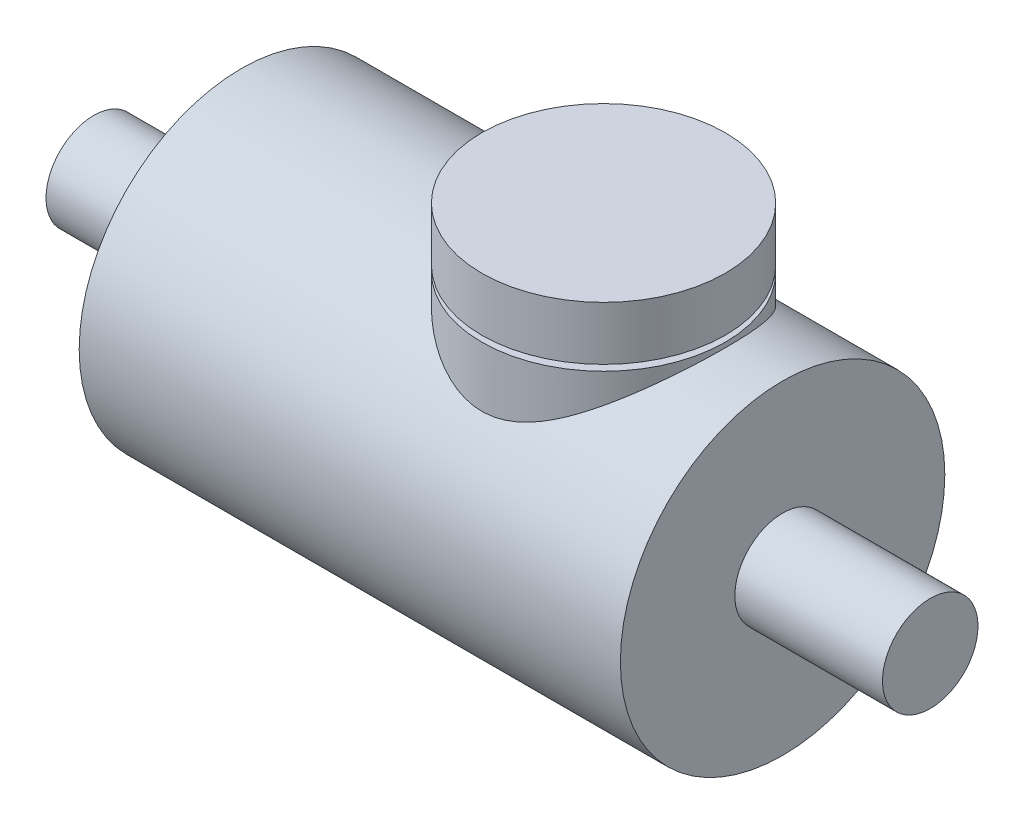
ISO-10303-21;
HEADER;
FILE_DESCRIPTION(('STEP AP214'),'2;1');
FILE_NAME('part.step','',(''),(''),'','','');
FILE_SCHEMA(('AUTOMOTIVE_DESIGN { 1 0 10303 214 1 1 1 1 }'));
ENDSEC;
DATA;
#1=APPLICATION_CONTEXT('core data for automotive mechanical design processes');
#2=APPLICATION_PROTOCOL_DEFINITION('international standard','automotive_design',2000,#1);
#3=PRODUCT_CONTEXT('',#1,'mechanical');
#4=PRODUCT('Part','Part','',(#3));
#5=PRODUCT_RELATED_PRODUCT_CATEGORY('part','',(#4));
#6=PRODUCT_DEFINITION_FORMATION('','',#4);
#7=PRODUCT_DEFINITION_CONTEXT('part definition',#1,'design');
#8=PRODUCT_DEFINITION('design','',#6,#7);
#9=PRODUCT_DEFINITION_SHAPE('','',#8);
#10=(LENGTH_UNIT() NAMED_UNIT(*) SI_UNIT(.MILLI.,.METRE.));
#11=(NAMED_UNIT(*) PLANE_ANGLE_UNIT() SI_UNIT($,.RADIAN.));
#12=(NAMED_UNIT(*) SI_UNIT($,.STERADIAN.) SOLID_ANGLE_UNIT());
#13=UNCERTAINTY_MEASURE_WITH_UNIT(LENGTH_MEASURE(1.E-05),#10,'distance_accuracy_value','');
#14=(GEOMETRIC_REPRESENTATION_CONTEXT(3) GLOBAL_UNCERTAINTY_ASSIGNED_CONTEXT((#13)) GLOBAL_UNIT_ASSIGNED_CONTEXT((#10,
#11,#12)) REPRESENTATION_CONTEXT('',''));
#15=CARTESIAN_POINT('',(0.,0.,0.));
#16=DIRECTION('',(0.,0.,1.));
#17=DIRECTION('',(1.,0.,0.));
#18=AXIS2_PLACEMENT_3D('',#15,#16,#17);
#19=CARTESIAN_POINT('',(30.34,14.,0.));
#20=DIRECTION('',(0.,1.,0.));
#21=DIRECTION('',(0.,0.,1.));
#22=AXIS2_PLACEMENT_3D('',#19,#20,#21);
#23=PLANE('',#22);
#24=CARTESIAN_POINT('',(30.34,14.,0.));
#25=DIRECTION('',(0.,1.,0.));
#26=DIRECTION('',(0.,0.,1.));
#27=AXIS2_PLACEMENT_3D('',#24,#25,#26);
#28=CIRCLE('',#27,10.2);
#29=CARTESIAN_POINT('',(30.34,14.,10.2));
#30=VERTEX_POINT('',#29);
#31=EDGE_CURVE('E66',#30,#30,#28,.T.);
#32=ORIENTED_EDGE('',*,*,#31,.T.);
#33=EDGE_LOOP('',(#32));
#34=FACE_BOUND('',#33,.T.);
#35=CARTESIAN_POINT('',(30.34,14.,0.));
#36=DIRECTION('',(0.,1.,0.));
#37=DIRECTION('',(0.,0.,1.));
#38=AXIS2_PLACEMENT_3D('',#35,#36,#37);
#39=CIRCLE('',#38,9.44075635038653);
#40=CARTESIAN_POINT('',(30.34,14.,9.44075635038653));
#41=VERTEX_POINT('',#40);
#42=EDGE_CURVE('E70',#41,#41,#39,.T.);
#43=ORIENTED_EDGE('',*,*,#42,.F.);
#44=EDGE_LOOP('',(#43));
#45=FACE_BOUND('',#44,.T.);
#46=ADVANCED_FACE('F33',(#34,#45),#23,.T.);
#47=CARTESIAN_POINT('',(45.34,0.,0.));
#48=DIRECTION('',(-1.,0.,0.));
#49=DIRECTION('',(0.,0.,1.));
#50=AXIS2_PLACEMENT_3D('',#47,#48,#49);
#51=CYLINDRICAL_SURFACE('',#50,13.59);
#52=CARTESIAN_POINT('',(0.,0.,0.));
#53=DIRECTION('',(1.,0.,0.));
#54=DIRECTION('',(0.,0.,-1.));
#55=AXIS2_PLACEMENT_3D('',#52,#53,#54);
#56=CIRCLE('',#55,13.59);
#57=CARTESIAN_POINT('',(0.,0.,-13.59));
#58=VERTEX_POINT('',#57);
#59=EDGE_CURVE('E52',#58,#58,#56,.T.);
#60=ORIENTED_EDGE('',*,*,#59,.T.);
#61=EDGE_LOOP('',(#60));
#62=FACE_BOUND('',#61,.T.);
#63=CARTESIAN_POINT('',(45.34,0.,0.));
#64=DIRECTION('',(1.,0.,0.));
#65=DIRECTION('',(0.,0.,-1.));
#66=AXIS2_PLACEMENT_3D('',#63,#64,#65);
#67=CIRCLE('',#66,13.59);
#68=CARTESIAN_POINT('',(45.34,0.,-13.59));
#69=VERTEX_POINT('',#68);
#70=EDGE_CURVE('E48',#69,#69,#67,.T.);
#71=ORIENTED_EDGE('',*,*,#70,.F.);
#72=EDGE_LOOP('',(#71));
#73=FACE_BOUND('',#72,.T.);
#74=CARTESIAN_POINT('',(30.34,8.98042872027833,-10.2));
#75=CARTESIAN_POINT('',(30.1020213295422,8.98043561519694,-10.1999966529244));
#76=CARTESIAN_POINT('',(29.8639914981731,8.98994357065077,-10.1916470778944));
#77=CARTESIAN_POINT('',(29.3905237829943,9.02739270939349,-10.1584878934517));
#78=CARTESIAN_POINT('',(29.1550867749866,9.05533993799249,-10.1336728858368));
#79=CARTESIAN_POINT('',(28.6885744564679,9.12809255473376,-10.0681879867735));
#80=CARTESIAN_POINT('',(28.4575099895532,9.17293523118419,-10.027483018907));
#81=CARTESIAN_POINT('',(28.0017866789188,9.277179581264,-9.93111571547713));
#82=CARTESIAN_POINT('',(27.7771317894162,9.33659003417493,-9.87544435845111));
#83=CARTESIAN_POINT('',(27.3385724640432,9.46643575184599,-9.75103325096101));
#84=CARTESIAN_POINT('',(27.124559750049,9.53669977313039,-9.68249342156578));
#85=CARTESIAN_POINT('',(26.7044222414147,9.68643336813393,-9.53269724223959));
#86=CARTESIAN_POINT('',(26.4982965981397,9.76590194773257,-9.45144226525143));
#87=CARTESIAN_POINT('',(26.0942105527713,9.93181214768984,-9.27694419537602));
#88=CARTESIAN_POINT('',(25.8962474182058,10.0182514054359,-9.18370515800636));
#89=CARTESIAN_POINT('',(25.5084807746146,10.1961757964148,-8.98575638892083));
#90=CARTESIAN_POINT('',(25.3186785084343,10.2876616934075,-8.88104491858571));
#91=CARTESIAN_POINT('',(24.9083193232332,10.4934958588965,-8.63742541111809));
#92=CARTESIAN_POINT('',(24.6896674105793,10.6086128568763,-8.49595251421035));
#93=CARTESIAN_POINT('',(24.264550701279,10.841010936904,-8.19734072330779));
#94=CARTESIAN_POINT('',(24.0580869101324,10.9582921964552,-8.04020053965529));
#95=CARTESIAN_POINT('',(23.6573619720841,11.1928248330485,-7.71036816189492));
#96=CARTESIAN_POINT('',(23.4631184139957,11.3100759355614,-7.53765438422834));
#97=CARTESIAN_POINT('',(23.0876467830217,11.5422253953944,-7.17712471309008));
#98=CARTESIAN_POINT('',(22.9064197942952,11.6571235561678,-6.98930756440325));
#99=CARTESIAN_POINT('',(22.5219427680374,11.905645687461,-6.55877098865988));
#100=CARTESIAN_POINT('',(22.3217931454462,12.0382803555392,-6.3126892194922));
#101=CARTESIAN_POINT('',(21.9431326828629,12.2937368250018,-5.79950876155399));
#102=CARTESIAN_POINT('',(21.7646267195953,12.4165564127463,-5.53240535848803));
#103=CARTESIAN_POINT('',(21.4317918907044,12.6487187330193,-4.97874977316707));
#104=CARTESIAN_POINT('',(21.2774174155285,12.7580868039596,-4.69223578438319));
#105=CARTESIAN_POINT('',(20.9950043163087,12.9602206384658,-4.10100380265269));
#106=CARTESIAN_POINT('',(20.866951730701,13.0529952000931,-3.79629557149549));
#107=CARTESIAN_POINT('',(20.6741106230508,13.1937334591291,-3.26565279766639));
#108=CARTESIAN_POINT('',(20.6018964994737,13.2467676397792,-3.04372845908178));
#109=CARTESIAN_POINT('',(20.4724088263375,13.3422463257816,-2.59335734477488));
#110=CARTESIAN_POINT('',(20.4151317095126,13.3846933594576,-2.36491214085549));
#111=CARTESIAN_POINT('',(20.3163090278168,13.4581346709572,-1.90298937795116));
#112=CARTESIAN_POINT('',(20.2747529563833,13.4891365973469,-1.66951529051095));
#113=CARTESIAN_POINT('',(20.2079230599151,13.5390763680449,-1.19895187803248));
#114=CARTESIAN_POINT('',(20.1826498188711,13.5580137796539,-0.961862423639689));
#115=CARTESIAN_POINT('',(20.1487380679499,13.583438188305,-0.485198545827151));
#116=CARTESIAN_POINT('',(20.1401434528802,13.5898923317346,-0.245619229030259));
#117=CARTESIAN_POINT('',(20.1398601148948,13.5901049904652,0.233554188067803));
#118=CARTESIAN_POINT('',(20.1481713250248,13.5838635560463,0.473148288306664));
#119=CARTESIAN_POINT('',(20.1815682831292,13.5588241889692,0.950544795348977));
#120=CARTESIAN_POINT('',(20.2066573381727,13.5400237808215,1.18834683957465));
#121=CARTESIAN_POINT('',(20.2732205034577,13.4902802354689,1.66034843843747));
#122=CARTESIAN_POINT('',(20.3146945034721,13.4593371799517,1.89454801729859));
#123=CARTESIAN_POINT('',(20.4117000003531,13.3872412019798,2.34970626892462));
#124=CARTESIAN_POINT('',(20.4666938240658,13.346479776049,2.57084241450403));
#125=CARTESIAN_POINT('',(20.5907059158738,13.2550021557223,3.00711052927104));
#126=CARTESIAN_POINT('',(20.659729066679,13.2042824957129,3.22224037832222));
#127=CARTESIAN_POINT('',(20.8109898754672,13.0937949768979,3.64532987947436));
#128=CARTESIAN_POINT('',(20.8932242019355,13.0340293994564,3.85329132324464));
#129=CARTESIAN_POINT('',(21.0701368095385,12.9063826062745,4.26135130508833));
#130=CARTESIAN_POINT('',(21.1648196099725,12.8384984439721,4.46144695312456));
#131=CARTESIAN_POINT('',(21.3766446156326,12.6879353275987,4.87418814850364));
#132=CARTESIAN_POINT('',(21.4951076290557,12.6044503676775,5.08586162373657));
#133=CARTESIAN_POINT('',(21.7453169820829,12.4301494841638,5.49814566446047));
#134=CARTESIAN_POINT('',(21.8770689041222,12.3393304828913,5.69875152544066));
#135=CARTESIAN_POINT('',(22.152966887909,12.1517639827431,6.08847426734108));
#136=CARTESIAN_POINT('',(22.2971187555959,12.0550137128699,6.27758569480237));
#137=CARTESIAN_POINT('',(22.5969927021062,11.8570476175483,6.64393600091336));
#138=CARTESIAN_POINT('',(22.7527161845734,11.7558312509666,6.82117343426586));
#139=CARTESIAN_POINT('',(23.1068406814833,11.5301586800664,7.19726484028111));
#140=CARTESIAN_POINT('',(23.3076080585748,11.4050502292899,7.39350496327263));
#141=CARTESIAN_POINT('',(23.7240233657491,11.1531049429556,7.76835624274743));
#142=CARTESIAN_POINT('',(23.9396741574068,11.0262677788079,7.94696399299105));
#143=CARTESIAN_POINT('',(24.3854472522052,10.7736272888016,8.28624194563674));
#144=CARTESIAN_POINT('',(24.6155772436583,10.6478245529891,8.44690249042631));
#145=CARTESIAN_POINT('',(25.089916208684,10.4005054040654,8.74961477451343));
#146=CARTESIAN_POINT('',(25.334122033258,10.2789880419742,8.89167065289425));
#147=CARTESIAN_POINT('',(25.7871234403344,10.0670255533981,9.13035282755062));
#148=CARTESIAN_POINT('',(25.9934475444467,9.97516686152237,9.23042089590296));
#149=CARTESIAN_POINT('',(26.4150479584923,9.79881065059537,9.4174265229266));
#150=CARTESIAN_POINT('',(26.6303241752157,9.71431305492833,9.50436421826838));
#151=CARTESIAN_POINT('',(27.0691799918623,9.55534500900117,9.66416932274306));
#152=CARTESIAN_POINT('',(27.2927440280009,9.48085686914201,9.73706165575236));
#153=CARTESIAN_POINT('',(27.7479127813657,9.34451408551882,9.86798382791329));
#154=CARTESIAN_POINT('',(27.9795142777203,9.28265444796465,9.92601954425075));
#155=CARTESIAN_POINT('',(28.4029268321126,9.18513772647791,10.0162287354937));
#156=CARTESIAN_POINT('',(28.5934957270592,9.14671637905449,10.0512499303974));
#157=CARTESIAN_POINT('',(28.9781302086233,9.08113015602638,10.1105458900931));
#158=CARTESIAN_POINT('',(29.1721937533983,9.0539589165382,10.1348267309473));
#159=CARTESIAN_POINT('',(29.5625591584271,9.01193121333539,10.1722167220991));
#160=CARTESIAN_POINT('',(29.7588589036899,8.99706395748244,10.1853356630683));
#161=CARTESIAN_POINT('',(30.1524510318805,8.98023518467746,10.2001767313951));
#162=CARTESIAN_POINT('',(30.3497434246624,8.97827379609619,10.2018987453908));
#163=CARTESIAN_POINT('',(30.743866676782,8.98734540580929,10.1939078503472));
#164=CARTESIAN_POINT('',(30.9406973352926,8.99838327744166,10.1841906528225));
#165=CARTESIAN_POINT('',(31.3323540742139,9.03298419193916,10.153512934526));
#166=CARTESIAN_POINT('',(31.5271801522333,9.05654724974391,10.1325524003434));
#167=CARTESIAN_POINT('',(31.913809533483,9.11528435725864,10.079744253626));
#168=CARTESIAN_POINT('',(32.1056087782191,9.15047280358291,10.0478831403151));
#169=CARTESIAN_POINT('',(32.4850579449079,9.23119508026705,9.97377228109357));
#170=CARTESIAN_POINT('',(32.6727053627571,9.27673497680801,9.93151644244304));
#171=CARTESIAN_POINT('',(33.1122393166064,9.39539482763206,9.81954993934852));
#172=CARTESIAN_POINT('',(33.3619558578508,9.47246419568391,9.74547892900046));
#173=CARTESIAN_POINT('',(33.8510104355591,9.63962748974536,9.58016081228455));
#174=CARTESIAN_POINT('',(34.0903484410733,9.72972145459181,9.48891365470049));
#175=CARTESIAN_POINT('',(34.5586465896252,9.91963684731111,9.29020023176626));
#176=CARTESIAN_POINT('',(34.7875895792981,10.0194735543315,9.18270834080872));
#177=CARTESIAN_POINT('',(35.2345174639581,10.2257077000043,8.95247944409261));
#178=CARTESIAN_POINT('',(35.4525033446866,10.332104546558,8.82974381317718));
#179=CARTESIAN_POINT('',(35.8850461738177,10.552715763828,8.56498863770722));
#180=CARTESIAN_POINT('',(36.0992041610404,10.6670736031573,8.4224377887387));
#181=CARTESIAN_POINT('',(36.5155593710266,10.8975033824537,8.12209059481982));
#182=CARTESIAN_POINT('',(36.7177565490755,11.0135753288268,7.9642941928809));
#183=CARTESIAN_POINT('',(37.1099701049679,11.2452457579171,7.63369554414651));
#184=CARTESIAN_POINT('',(37.2999810686772,11.3608440091196,7.46088670675957));
#185=CARTESIAN_POINT('',(37.6672230149914,11.5894631899538,7.10056237884831));
#186=CARTESIAN_POINT('',(37.8444525383118,11.7024838242893,6.91304521412892));
#187=CARTESIAN_POINT('',(38.2229756074723,11.9484045853402,6.48062133530752));
#188=CARTESIAN_POINT('',(38.4209692347453,12.0801990900411,6.23217225834731));
#189=CARTESIAN_POINT('',(38.7950889799861,12.3336007226193,5.71432424535759));
#190=CARTESIAN_POINT('',(38.9712101102809,12.455205524849,5.44492055365765));
#191=CARTESIAN_POINT('',(39.299040148496,12.6845897031539,4.88673450086284));
#192=CARTESIAN_POINT('',(39.4507901283949,12.7923922761795,4.59798593042866));
#193=CARTESIAN_POINT('',(39.7276380952772,12.9910180248687,4.00248809101808));
#194=CARTESIAN_POINT('',(39.8527504753714,13.0818503668011,3.69574865792686));
#195=CARTESIAN_POINT('',(40.0400311116596,13.2187737582415,3.16277123987336));
#196=CARTESIAN_POINT('',(40.1097616440071,13.270063534598,2.94049161985932));
#197=CARTESIAN_POINT('',(40.2342567276773,13.3619851760301,2.48964479609886));
#198=CARTESIAN_POINT('',(40.2890248494018,13.4026195836478,2.261079106718));
#199=CARTESIAN_POINT('',(40.3828309614479,13.4724003934638,1.79917966206977));
#200=CARTESIAN_POINT('',(40.4218799755998,13.5015548462549,1.56584936931082));
#201=CARTESIAN_POINT('',(40.4837324337245,13.5478036920206,1.09584232346649));
#202=CARTESIAN_POINT('',(40.506535273114,13.5648976361765,0.859165446175939));
#203=CARTESIAN_POINT('',(40.5355718219161,13.586673319237,0.383651905214575));
#204=CARTESIAN_POINT('',(40.5417655987035,13.5913251438923,0.144811419145382));
#205=CARTESIAN_POINT('',(40.5373698155492,13.5880259456576,-0.332626091048634));
#206=CARTESIAN_POINT('',(40.526780327383,13.5800749766648,-0.571223116210278));
#207=CARTESIAN_POINT('',(40.4889836083491,13.551745730018,-1.04640019138994));
#208=CARTESIAN_POINT('',(40.4617726759968,13.5313646842704,-1.28297978023602));
#209=CARTESIAN_POINT('',(40.391150224307,13.4786189947627,-1.75234255164824));
#210=CARTESIAN_POINT('',(40.3477387577468,13.446254390042,-1.9851257465795));
#211=CARTESIAN_POINT('',(40.2468864591566,13.3713647499438,-2.43841944600712));
#212=CARTESIAN_POINT('',(40.1899065763411,13.3291743816893,-2.65908852387286));
#213=CARTESIAN_POINT('',(40.0619873096091,13.2349260224866,-3.09425569723276));
#214=CARTESIAN_POINT('',(39.9910430554106,13.1828645890909,-3.30875160974235));
#215=CARTESIAN_POINT('',(39.8360170075827,13.0697983053733,-3.73043093869889));
#216=CARTESIAN_POINT('',(39.7519385870184,13.0087957515224,-3.9376162159336));
#217=CARTESIAN_POINT('',(39.5714175963282,12.8787906516043,-4.3440062237344));
#218=CARTESIAN_POINT('',(39.4749705466061,12.8097852079689,-4.54320802841659));
#219=CARTESIAN_POINT('',(39.2590543824952,12.6566662470774,-4.95483355404485));
#220=CARTESIAN_POINT('',(39.1382162877594,12.5717263193462,-5.16623165362375));
#221=CARTESIAN_POINT('',(38.8832428595342,12.3946231405787,-5.57778038394492));
#222=CARTESIAN_POINT('',(38.749101923215,12.3024568494269,-5.77792621942569));
#223=CARTESIAN_POINT('',(38.4684006331297,12.1123212737202,-6.16657080744335));
#224=CARTESIAN_POINT('',(38.3218337044249,12.0143489253752,-6.35506330150825));
#225=CARTESIAN_POINT('',(38.0171049846291,11.8140954398658,-6.7200137206404));
#226=CARTESIAN_POINT('',(37.8589418030843,11.71181378662,-6.8964701976113));
#227=CARTESIAN_POINT('',(37.4992524149134,11.4839002086559,-7.27084439736382));
#228=CARTESIAN_POINT('',(37.2953386244771,11.3576527017011,-7.46609951513231));
#229=CARTESIAN_POINT('',(36.8725245630085,11.1037553877763,-7.83872151107841));
#230=CARTESIAN_POINT('',(36.6536212629,10.9761053017749,-8.01608475565514));
#231=CARTESIAN_POINT('',(36.201226844763,10.7222662137025,-8.35257656953231));
#232=CARTESIAN_POINT('',(35.9677290084929,10.5960779166861,-8.51169664407718));
#233=CARTESIAN_POINT('',(35.4865075615499,10.3485293530729,-8.81100021130496));
#234=CARTESIAN_POINT('',(35.2387875824261,10.2271678672554,-8.95118850773866));
#235=CARTESIAN_POINT('',(34.783599363611,10.0180845187001,-9.18395800155017));
#236=CARTESIAN_POINT('',(34.5788171913516,9.92870924787328,-9.28031542395692));
#237=CARTESIAN_POINT('',(34.1605878002336,9.75748918715734,-9.46017526284682));
#238=CARTESIAN_POINT('',(33.9471405523057,9.6756444225343,-9.54367763619975));
#239=CARTESIAN_POINT('',(33.5123486440822,9.52211256974148,-9.69686618423137));
#240=CARTESIAN_POINT('',(33.291022406901,9.45040351338105,-9.76658237432285));
#241=CARTESIAN_POINT('',(32.8406691675594,9.31960823350651,-9.89147091212448));
#242=CARTESIAN_POINT('',(32.611644867375,9.26051763344404,-9.94664830398687));
#243=CARTESIAN_POINT('',(32.2141263806917,9.17248426975921,-10.0277666359649));
#244=CARTESIAN_POINT('',(32.0472430949132,9.13976274121623,-10.0575493303099));
#245=CARTESIAN_POINT('',(31.7107792172085,9.08293248635191,-10.108902480845));
#246=CARTESIAN_POINT('',(31.5411991664172,9.05882205434233,-10.130474563451));
#247=CARTESIAN_POINT('',(31.2001674280167,9.01993985629112,-10.1651103695756));
#248=CARTESIAN_POINT('',(31.0287165233321,9.0051643255148,-10.1781775231681));
#249=CARTESIAN_POINT('',(30.6848525673211,8.9854072353971,-10.1956226851952));
#250=CARTESIAN_POINT('',(30.5124397146126,8.98042372420959,-10.2000024252962));
#251=CARTESIAN_POINT('',(30.34,8.98042872027833,-10.2));
#252=B_SPLINE_CURVE_WITH_KNOTS('',3,(#74,#75,#76,#77,#78,#79,#80,#81,#82,#83,#84,#85,#86,#87,
#88,#89,#90,#91,#92,#93,#94,#95,#96,#97,#98,#99,#100,#101,#102,#103,#104,#105,#106,#107,#108,
#109,#110,#111,#112,#113,#114,#115,#116,#117,#118,#119,#120,#121,#122,#123,#124,#125,#126,#127,
#128,#129,#130,#131,#132,#133,#134,#135,#136,#137,#138,#139,#140,#141,#142,#143,#144,#145,#146,
#147,#148,#149,#150,#151,#152,#153,#154,#155,#156,#157,#158,#159,#160,#161,#162,#163,#164,#165,
#166,#167,#168,#169,#170,#171,#172,#173,#174,#175,#176,#177,#178,#179,#180,#181,#182,#183,#184,
#185,#186,#187,#188,#189,#190,#191,#192,#193,#194,#195,#196,#197,#198,#199,#200,#201,#202,#203,
#204,#205,#206,#207,#208,#209,#210,#211,#212,#213,#214,#215,#216,#217,#218,#219,#220,#221,#222,
#223,#224,#225,#226,#227,#228,#229,#230,#231,#232,#233,#234,#235,#236,#237,#238,#239,#240,#241,
#242,#243,#244,#245,#246,#247,#248,#249,#250,#251),.UNSPECIFIED.,.T.,.F.,(4,2,2,2,2,2,2,2,2,2,2,
2,2,2,2,2,2,2,2,2,2,2,2,2,2,2,2,2,2,2,2,2,2,2,2,2,2,2,2,2,2,2,2,2,2,2,2,2,2,2,2,2,2,2,2,2,2,2,2,
2,2,2,2,2,2,2,2,2,2,2,2,2,2,2,2,2,2,2,2,2,2,2,2,2,2,2,2,2,4),(0.,0.713698200889761,
1.42763050386337,2.14314777618868,2.85909731993134,3.56472781220565,4.27028216516237,
4.97559837752901,5.68102162708567,6.53448578623502,7.38802025665084,8.24275638230262,
9.09756361716182,10.1275912221385,11.1578504821484,12.1861383290982,13.2138793397589,
13.9311522960389,14.6482537955272,15.3648751973135,16.0815222996017,16.800052929441,
17.5185807135969,18.237250168016,18.9559147877876,19.649644308993,20.3436156876994,
21.0374123387945,21.7314615652391,22.50032185024,23.2695064757678,24.0390532322521,
24.8086934880727,25.7298554625007,26.6511950411359,27.5730280397045,28.4946556033281,
29.2351794762129,29.9756956406543,30.7148853865985,31.4537822601725,32.045796643307,
32.6374756807862,33.2286351897747,33.8198005788399,34.4111876625272,35.0025754516035,
35.5946983642373,36.1871691728436,37.0008190777992,37.8144714089523,38.6294209161429,
39.4442969757926,40.2882094724536,41.132125123819,41.9764131521488,42.8207974225458,
43.8511980402157,44.8818331945033,45.9107127983243,46.9390350481356,47.6539422474541,
48.3686787028945,49.0829130358184,49.7971739467885,50.5131505986125,51.2291241884872,
51.9452572790532,52.6613880366589,53.3559919152781,54.0508384779453,54.745506885335,
55.4404275978844,56.2133493276873,56.9865979869407,57.7602583781367,58.5340116875974,
59.4608743307111,60.3879248299096,61.3154052629073,62.2426499129844,62.9720952132561,
63.7015429608507,64.429384625601,65.1569734363879,65.6745347748849,66.1919935377654,
66.7092434778031,67.2263903037948),.UNSPECIFIED.);
#253=CARTESIAN_POINT('',(30.34,8.98042872027833,-10.2));
#254=VERTEX_POINT('',#253);
#255=EDGE_CURVE('E10',#254,#254,#252,.T.);
#256=ORIENTED_EDGE('',*,*,#255,.F.);
#257=EDGE_LOOP('',(#256));
#258=FACE_BOUND('',#257,.T.);
#259=ADVANCED_FACE('F35',(#62,#73,#258),#51,.T.);
#260=CARTESIAN_POINT('',(0.,0.,0.));
#261=DIRECTION('',(1.,0.,0.));
#262=DIRECTION('',(0.,0.,-1.));
#263=AXIS2_PLACEMENT_3D('',#260,#261,#262);
#264=PLANE('',#263);
#265=ORIENTED_EDGE('',*,*,#59,.F.);
#266=EDGE_LOOP('',(#265));
#267=FACE_BOUND('',#266,.T.);
#268=CARTESIAN_POINT('',(0.,0.,0.));
#269=DIRECTION('',(1.,0.,0.));
#270=DIRECTION('',(0.,0.,-1.));
#271=AXIS2_PLACEMENT_3D('',#268,#269,#270);
#272=CIRCLE('',#271,4.);
#273=CARTESIAN_POINT('',(0.,0.,-4.));
#274=VERTEX_POINT('',#273);
#275=EDGE_CURVE('E44',#274,#274,#272,.F.);
#276=ORIENTED_EDGE('',*,*,#275,.F.);
#277=EDGE_LOOP('',(#276));
#278=FACE_BOUND('',#277,.T.);
#279=ADVANCED_FACE('F111',(#267,#278),#264,.F.);
#280=CARTESIAN_POINT('',(45.34,0.,0.));
#281=DIRECTION('',(1.,0.,0.));
#282=DIRECTION('',(0.,0.,-1.));
#283=AXIS2_PLACEMENT_3D('',#280,#281,#282);
#284=PLANE('',#283);
#285=ORIENTED_EDGE('',*,*,#70,.T.);
#286=EDGE_LOOP('',(#285));
#287=FACE_BOUND('',#286,.T.);
#288=CARTESIAN_POINT('',(45.34,0.,0.));
#289=DIRECTION('',(1.,0.,0.));
#290=DIRECTION('',(0.,0.,-1.));
#291=AXIS2_PLACEMENT_3D('',#288,#289,#290);
#292=CIRCLE('',#291,4.);
#293=CARTESIAN_POINT('',(45.34,0.,-4.));
#294=VERTEX_POINT('',#293);
#295=EDGE_CURVE('E58',#294,#294,#292,.T.);
#296=ORIENTED_EDGE('',*,*,#295,.F.);
#297=EDGE_LOOP('',(#296));
#298=FACE_BOUND('',#297,.T.);
#299=ADVANCED_FACE('F131',(#287,#298),#284,.T.);
#300=CARTESIAN_POINT('',(57.71,0.,0.));
#301=DIRECTION('',(-1.,0.,0.));
#302=DIRECTION('',(0.,0.,1.));
#303=AXIS2_PLACEMENT_3D('',#300,#301,#302);
#304=CYLINDRICAL_SURFACE('',#303,4.);
#305=CARTESIAN_POINT('',(57.71,0.,0.));
#306=DIRECTION('',(1.,0.,0.));
#307=DIRECTION('',(0.,0.,-1.));
#308=AXIS2_PLACEMENT_3D('',#305,#306,#307);
#309=CIRCLE('',#308,4.);
#310=CARTESIAN_POINT('',(57.71,0.,-4.));
#311=VERTEX_POINT('',#310);
#312=EDGE_CURVE('E56',#311,#311,#309,.T.);
#313=ORIENTED_EDGE('',*,*,#312,.F.);
#314=EDGE_LOOP('',(#313));
#315=FACE_BOUND('',#314,.T.);
#316=ORIENTED_EDGE('',*,*,#295,.T.);
#317=EDGE_LOOP('',(#316));
#318=FACE_BOUND('',#317,.T.);
#319=ADVANCED_FACE('F127',(#315,#318),#304,.T.);
#320=CARTESIAN_POINT('',(57.71,0.,0.));
#321=DIRECTION('',(1.,0.,0.));
#322=DIRECTION('',(0.,0.,-1.));
#323=AXIS2_PLACEMENT_3D('',#320,#321,#322);
#324=PLANE('',#323);
#325=ORIENTED_EDGE('',*,*,#312,.T.);
#326=EDGE_LOOP('',(#325));
#327=FACE_BOUND('',#326,.T.);
#328=ADVANCED_FACE('F123',(#327),#324,.T.);
#329=CARTESIAN_POINT('',(-12.37,0.,0.));
#330=DIRECTION('',(1.,0.,0.));
#331=DIRECTION('',(0.,0.,-1.));
#332=AXIS2_PLACEMENT_3D('',#329,#330,#331);
#333=CYLINDRICAL_SURFACE('',#332,4.);
#334=CARTESIAN_POINT('',(-12.37,0.,0.));
#335=DIRECTION('',(-1.,0.,0.));
#336=DIRECTION('',(0.,0.,1.));
#337=AXIS2_PLACEMENT_3D('',#334,#335,#336);
#338=CIRCLE('',#337,4.);
#339=CARTESIAN_POINT('',(-12.37,0.,4.));
#340=VERTEX_POINT('',#339);
#341=EDGE_CURVE('E61',#340,#340,#338,.T.);
#342=ORIENTED_EDGE('',*,*,#341,.F.);
#343=EDGE_LOOP('',(#342));
#344=FACE_BOUND('',#343,.T.);
#345=ORIENTED_EDGE('',*,*,#275,.T.);
#346=EDGE_LOOP('',(#345));
#347=FACE_BOUND('',#346,.T.);
#348=ADVANCED_FACE('F119',(#344,#347),#333,.T.);
#349=CARTESIAN_POINT('',(-12.37,0.,0.));
#350=DIRECTION('',(-1.,0.,0.));
#351=DIRECTION('',(0.,0.,1.));
#352=AXIS2_PLACEMENT_3D('',#349,#350,#351);
#353=PLANE('',#352);
#354=ORIENTED_EDGE('',*,*,#341,.T.);
#355=EDGE_LOOP('',(#354));
#356=FACE_BOUND('',#355,.T.);
#357=ADVANCED_FACE('F115',(#356),#353,.T.);
#358=CARTESIAN_POINT('',(30.34,14.,0.));
#359=DIRECTION('',(0.,-1.,0.));
#360=DIRECTION('',(0.,0.,-1.));
#361=AXIS2_PLACEMENT_3D('',#358,#359,#360);
#362=CYLINDRICAL_SURFACE('',#361,10.2);
#363=ORIENTED_EDGE('',*,*,#31,.F.);
#364=EDGE_LOOP('',(#363));
#365=FACE_BOUND('',#364,.T.);
#366=ORIENTED_EDGE('',*,*,#255,.T.);
#367=EDGE_LOOP('',(#366));
#368=FACE_BOUND('',#367,.T.);
#369=ADVANCED_FACE('F99',(#365,#368),#362,.T.);
#370=CARTESIAN_POINT('',(30.34,14.5,0.));
#371=DIRECTION('',(0.,-1.,0.));
#372=DIRECTION('',(0.,0.,-1.));
#373=AXIS2_PLACEMENT_3D('',#370,#371,#372);
#374=CYLINDRICAL_SURFACE('',#373,9.44075635038653);
#375=CARTESIAN_POINT('',(30.34,14.5,0.));
#376=DIRECTION('',(0.,1.,0.));
#377=DIRECTION('',(0.,0.,1.));
#378=AXIS2_PLACEMENT_3D('',#375,#376,#377);
#379=CIRCLE('',#378,9.44075635038653);
#380=CARTESIAN_POINT('',(30.34,14.5,9.44075635038653));
#381=VERTEX_POINT('',#380);
#382=EDGE_CURVE('E69',#381,#381,#379,.T.);
#383=ORIENTED_EDGE('',*,*,#382,.F.);
#384=EDGE_LOOP('',(#383));
#385=FACE_BOUND('',#384,.T.);
#386=ORIENTED_EDGE('',*,*,#42,.T.);
#387=EDGE_LOOP('',(#386));
#388=FACE_BOUND('',#387,.T.);
#389=ADVANCED_FACE('F93',(#385,#388),#374,.T.);
#390=CARTESIAN_POINT('',(30.34,14.5,0.));
#391=DIRECTION('',(0.,1.,0.));
#392=DIRECTION('',(0.,0.,1.));
#393=AXIS2_PLACEMENT_3D('',#390,#391,#392);
#394=PLANE('',#393);
#395=CARTESIAN_POINT('',(30.34,14.5,0.));
#396=DIRECTION('',(0.,1.,0.));
#397=DIRECTION('',(0.,0.,1.));
#398=AXIS2_PLACEMENT_3D('',#395,#396,#397);
#399=CIRCLE('',#398,10.2);
#400=CARTESIAN_POINT('',(30.34,14.5,10.2));
#401=VERTEX_POINT('',#400);
#402=EDGE_CURVE('E76',#401,#401,#399,.T.);
#403=ORIENTED_EDGE('',*,*,#402,.F.);
#404=EDGE_LOOP('',(#403));
#405=FACE_BOUND('',#404,.T.);
#406=ORIENTED_EDGE('',*,*,#382,.T.);
#407=EDGE_LOOP('',(#406));
#408=FACE_BOUND('',#407,.T.);
#409=ADVANCED_FACE('F87',(#405,#408),#394,.F.);
#410=CARTESIAN_POINT('',(30.34,19.,0.));
#411=DIRECTION('',(0.,-1.,0.));
#412=DIRECTION('',(0.,0.,-1.));
#413=AXIS2_PLACEMENT_3D('',#410,#411,#412);
#414=CYLINDRICAL_SURFACE('',#413,10.2);
#415=CARTESIAN_POINT('',(30.34,19.,0.));
#416=DIRECTION('',(0.,1.,0.));
#417=DIRECTION('',(0.,0.,1.));
#418=AXIS2_PLACEMENT_3D('',#415,#416,#417);
#419=CIRCLE('',#418,10.2);
#420=CARTESIAN_POINT('',(30.34,19.,10.2));
#421=VERTEX_POINT('',#420);
#422=EDGE_CURVE('E73',#421,#421,#419,.T.);
#423=ORIENTED_EDGE('',*,*,#422,.F.);
#424=EDGE_LOOP('',(#423));
#425=FACE_BOUND('',#424,.T.);
#426=ORIENTED_EDGE('',*,*,#402,.T.);
#427=EDGE_LOOP('',(#426));
#428=FACE_BOUND('',#427,.T.);
#429=ADVANCED_FACE('F84',(#425,#428),#414,.T.);
#430=CARTESIAN_POINT('',(30.34,19.,0.));
#431=DIRECTION('',(0.,1.,0.));
#432=DIRECTION('',(0.,0.,1.));
#433=AXIS2_PLACEMENT_3D('',#430,#431,#432);
#434=PLANE('',#433);
#435=ORIENTED_EDGE('',*,*,#422,.T.);
#436=EDGE_LOOP('',(#435));
#437=FACE_BOUND('',#436,.T.);
#438=ADVANCED_FACE('F82',(#437),#434,.T.);
#439=CLOSED_SHELL('',(#46,#259,#279,#299,#319,#328,#348,#357,#369,#389,#409,#429,#438));
#440=MANIFOLD_SOLID_BREP('B2',#439);
#441=ADVANCED_BREP_SHAPE_REPRESENTATION('',(#18,#440),#14);
#442=SHAPE_DEFINITION_REPRESENTATION(#9,#441);
ENDSEC;
END-ISO-10303-21;
